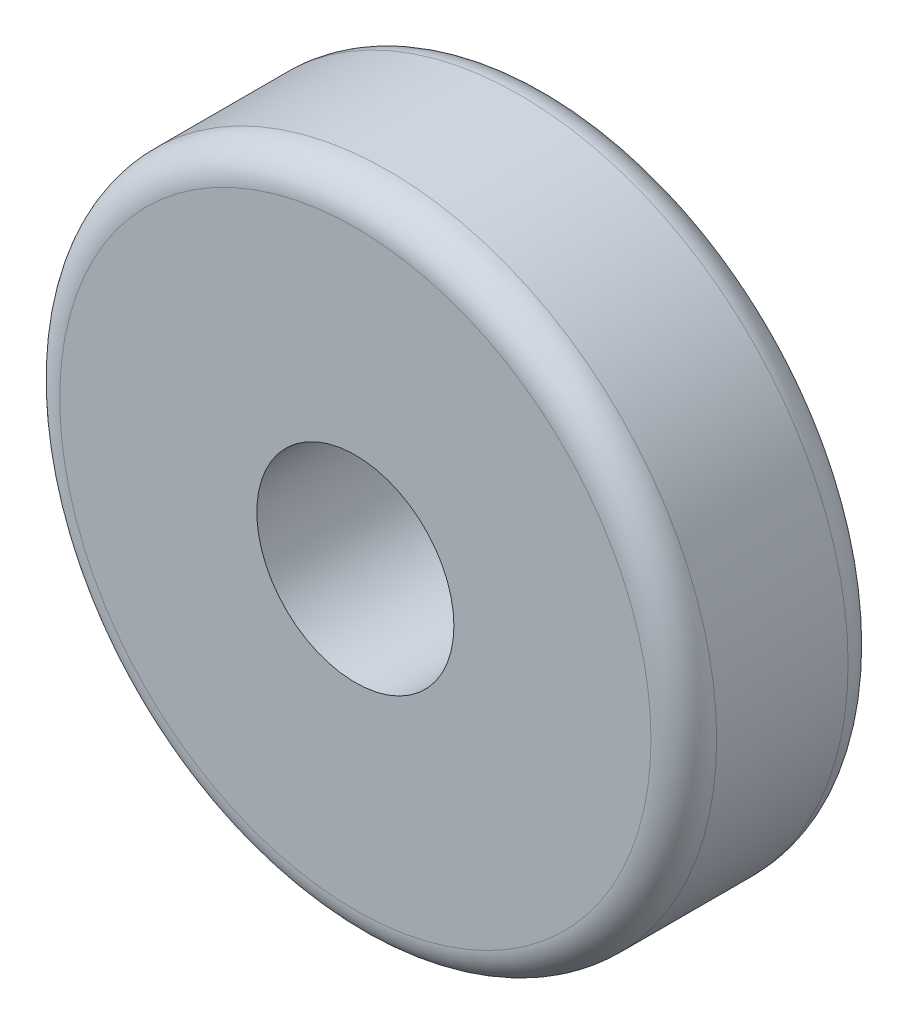
ISO-10303-21;
HEADER;
FILE_DESCRIPTION(('STEP AP214'),'2;1');
FILE_NAME('part.step','',(''),(''),'','','');
FILE_SCHEMA(('AUTOMOTIVE_DESIGN { 1 0 10303 214 1 1 1 1 }'));
ENDSEC;
DATA;
#1=APPLICATION_CONTEXT('core data for automotive mechanical design processes');
#2=APPLICATION_PROTOCOL_DEFINITION('international standard','automotive_design',2000,#1);
#3=PRODUCT_CONTEXT('',#1,'mechanical');
#4=PRODUCT('Part','Part','',(#3));
#5=PRODUCT_RELATED_PRODUCT_CATEGORY('part','',(#4));
#6=PRODUCT_DEFINITION_FORMATION('','',#4);
#7=PRODUCT_DEFINITION_CONTEXT('part definition',#1,'design');
#8=PRODUCT_DEFINITION('design','',#6,#7);
#9=PRODUCT_DEFINITION_SHAPE('','',#8);
#10=(LENGTH_UNIT() NAMED_UNIT(*) SI_UNIT(.MILLI.,.METRE.));
#11=(NAMED_UNIT(*) PLANE_ANGLE_UNIT() SI_UNIT($,.RADIAN.));
#12=(NAMED_UNIT(*) SI_UNIT($,.STERADIAN.) SOLID_ANGLE_UNIT());
#13=UNCERTAINTY_MEASURE_WITH_UNIT(LENGTH_MEASURE(1.E-05),#10,'distance_accuracy_value','');
#14=(GEOMETRIC_REPRESENTATION_CONTEXT(3) GLOBAL_UNCERTAINTY_ASSIGNED_CONTEXT((#13)) GLOBAL_UNIT_ASSIGNED_CONTEXT((#10,
#11,#12)) REPRESENTATION_CONTEXT('',''));
#15=CARTESIAN_POINT('',(0.,0.,0.));
#16=DIRECTION('',(0.,0.,1.));
#17=DIRECTION('',(1.,0.,0.));
#18=AXIS2_PLACEMENT_3D('',#15,#16,#17);
#19=CARTESIAN_POINT('',(0.,0.,6.));
#20=DIRECTION('',(0.,0.,1.));
#21=DIRECTION('',(1.,0.,0.));
#22=AXIS2_PLACEMENT_3D('',#19,#20,#21);
#23=PLANE('',#22);
#24=CARTESIAN_POINT('',(0.,0.,6.));
#25=DIRECTION('',(0.,0.,1.));
#26=DIRECTION('',(1.,0.,0.));
#27=AXIS2_PLACEMENT_3D('',#24,#25,#26);
#28=CIRCLE('',#27,9.);
#29=CARTESIAN_POINT('',(9.,0.,6.));
#30=VERTEX_POINT('',#29);
#31=EDGE_CURVE('E10',#30,#30,#28,.T.);
#32=ORIENTED_EDGE('',*,*,#31,.T.);
#33=EDGE_LOOP('',(#32));
#34=FACE_BOUND('',#33,.T.);
#35=CARTESIAN_POINT('',(0.,0.,6.));
#36=DIRECTION('',(0.,0.,1.));
#37=DIRECTION('',(1.,0.,0.));
#38=AXIS2_PLACEMENT_3D('',#35,#36,#37);
#39=CIRCLE('',#38,3.);
#40=CARTESIAN_POINT('',(3.,0.,6.));
#41=VERTEX_POINT('',#40);
#42=EDGE_CURVE('E53',#41,#41,#39,.T.);
#43=ORIENTED_EDGE('',*,*,#42,.F.);
#44=EDGE_LOOP('',(#43));
#45=FACE_BOUND('',#44,.T.);
#46=ADVANCED_FACE('F33',(#34,#45),#23,.T.);
#47=CARTESIAN_POINT('',(0.,0.,0.));
#48=DIRECTION('',(0.,0.,1.));
#49=DIRECTION('',(1.,0.,0.));
#50=AXIS2_PLACEMENT_3D('',#47,#48,#49);
#51=PLANE('',#50);
#52=CARTESIAN_POINT('',(0.,0.,0.));
#53=DIRECTION('',(0.,0.,1.));
#54=DIRECTION('',(1.,0.,0.));
#55=AXIS2_PLACEMENT_3D('',#52,#53,#54);
#56=CIRCLE('',#55,9.);
#57=CARTESIAN_POINT('',(9.,0.,0.));
#58=VERTEX_POINT('',#57);
#59=EDGE_CURVE('E40',#58,#58,#56,.F.);
#60=ORIENTED_EDGE('',*,*,#59,.T.);
#61=EDGE_LOOP('',(#60));
#62=FACE_BOUND('',#61,.T.);
#63=CARTESIAN_POINT('',(0.,0.,0.));
#64=DIRECTION('',(0.,0.,1.));
#65=DIRECTION('',(1.,0.,0.));
#66=AXIS2_PLACEMENT_3D('',#63,#64,#65);
#67=CIRCLE('',#66,3.);
#68=CARTESIAN_POINT('',(3.,0.,0.));
#69=VERTEX_POINT('',#68);
#70=EDGE_CURVE('E54',#69,#69,#67,.T.);
#71=ORIENTED_EDGE('',*,*,#70,.T.);
#72=EDGE_LOOP('',(#71));
#73=FACE_BOUND('',#72,.T.);
#74=ADVANCED_FACE('F64',(#62,#73),#51,.F.);
#75=CARTESIAN_POINT('',(0.,0.,6.));
#76=DIRECTION('',(0.,0.,-1.));
#77=DIRECTION('',(-1.,0.,0.));
#78=AXIS2_PLACEMENT_3D('',#75,#76,#77);
#79=CYLINDRICAL_SURFACE('',#78,10.);
#80=CARTESIAN_POINT('',(0.,0.,1.));
#81=DIRECTION('',(0.,0.,1.));
#82=DIRECTION('',(1.,0.,0.));
#83=AXIS2_PLACEMENT_3D('',#80,#81,#82);
#84=CIRCLE('',#83,10.);
#85=CARTESIAN_POINT('',(10.,0.,1.));
#86=VERTEX_POINT('',#85);
#87=EDGE_CURVE('E44',#86,#86,#84,.T.);
#88=ORIENTED_EDGE('',*,*,#87,.T.);
#89=EDGE_LOOP('',(#88));
#90=FACE_BOUND('',#89,.T.);
#91=CARTESIAN_POINT('',(0.,0.,5.));
#92=DIRECTION('',(0.,0.,1.));
#93=DIRECTION('',(1.,0.,0.));
#94=AXIS2_PLACEMENT_3D('',#91,#92,#93);
#95=CIRCLE('',#94,10.);
#96=CARTESIAN_POINT('',(10.,0.,5.));
#97=VERTEX_POINT('',#96);
#98=EDGE_CURVE('E48',#97,#97,#95,.F.);
#99=ORIENTED_EDGE('',*,*,#98,.T.);
#100=EDGE_LOOP('',(#99));
#101=FACE_BOUND('',#100,.T.);
#102=ADVANCED_FACE('F69',(#90,#101),#79,.T.);
#103=CARTESIAN_POINT('',(0.,0.,6.));
#104=DIRECTION('',(0.,0.,-1.));
#105=DIRECTION('',(-1.,0.,0.));
#106=AXIS2_PLACEMENT_3D('',#103,#104,#105);
#107=CYLINDRICAL_SURFACE('',#106,3.);
#108=ORIENTED_EDGE('',*,*,#42,.T.);
#109=EDGE_LOOP('',(#108));
#110=FACE_BOUND('',#109,.T.);
#111=ORIENTED_EDGE('',*,*,#70,.F.);
#112=EDGE_LOOP('',(#111));
#113=FACE_BOUND('',#112,.T.);
#114=ADVANCED_FACE('F60',(#110,#113),#107,.F.);
#115=CARTESIAN_POINT('',(0.,0.,1.));
#116=DIRECTION('',(0.,0.,1.));
#117=DIRECTION('',(1.,0.,0.));
#118=AXIS2_PLACEMENT_3D('',#115,#116,#117);
#119=TOROIDAL_SURFACE('',#118,9.,1.);
#120=ORIENTED_EDGE('',*,*,#59,.F.);
#121=EDGE_LOOP('',(#120));
#122=FACE_BOUND('',#121,.T.);
#123=ORIENTED_EDGE('',*,*,#87,.F.);
#124=EDGE_LOOP('',(#123));
#125=FACE_BOUND('',#124,.T.);
#126=ADVANCED_FACE('F75',(#122,#125),#119,.T.);
#127=CARTESIAN_POINT('',(0.,0.,5.));
#128=DIRECTION('',(0.,0.,1.));
#129=DIRECTION('',(1.,0.,0.));
#130=AXIS2_PLACEMENT_3D('',#127,#128,#129);
#131=TOROIDAL_SURFACE('',#130,9.,1.);
#132=ORIENTED_EDGE('',*,*,#98,.F.);
#133=EDGE_LOOP('',(#132));
#134=FACE_BOUND('',#133,.T.);
#135=ORIENTED_EDGE('',*,*,#31,.F.);
#136=EDGE_LOOP('',(#135));
#137=FACE_BOUND('',#136,.T.);
#138=ADVANCED_FACE('F35',(#134,#137),#131,.T.);
#139=CLOSED_SHELL('',(#46,#74,#102,#114,#126,#138));
#140=MANIFOLD_SOLID_BREP('B2',#139);
#141=ADVANCED_BREP_SHAPE_REPRESENTATION('',(#18,#140),#14);
#142=SHAPE_DEFINITION_REPRESENTATION(#9,#141);
ENDSEC;
END-ISO-10303-21;
